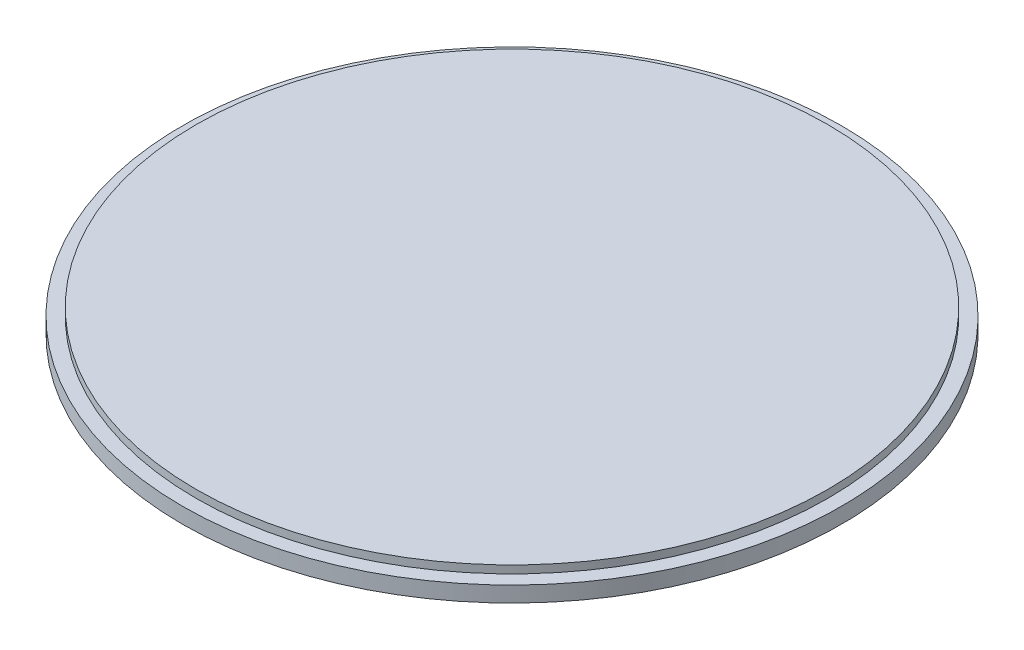
ISO-10303-21;
HEADER;
FILE_DESCRIPTION(('STEP AP214'),'2;1');
FILE_NAME('part.step','',(''),(''),'','','');
FILE_SCHEMA(('AUTOMOTIVE_DESIGN { 1 0 10303 214 1 1 1 1 }'));
ENDSEC;
DATA;
#1=APPLICATION_CONTEXT('core data for automotive mechanical design processes');
#2=APPLICATION_PROTOCOL_DEFINITION('international standard','automotive_design',2000,#1);
#3=PRODUCT_CONTEXT('',#1,'mechanical');
#4=PRODUCT('Part','Part','',(#3));
#5=PRODUCT_RELATED_PRODUCT_CATEGORY('part','',(#4));
#6=PRODUCT_DEFINITION_FORMATION('','',#4);
#7=PRODUCT_DEFINITION_CONTEXT('part definition',#1,'design');
#8=PRODUCT_DEFINITION('design','',#6,#7);
#9=PRODUCT_DEFINITION_SHAPE('','',#8);
#10=(LENGTH_UNIT() NAMED_UNIT(*) SI_UNIT(.MILLI.,.METRE.));
#11=(NAMED_UNIT(*) PLANE_ANGLE_UNIT() SI_UNIT($,.RADIAN.));
#12=(NAMED_UNIT(*) SI_UNIT($,.STERADIAN.) SOLID_ANGLE_UNIT());
#13=UNCERTAINTY_MEASURE_WITH_UNIT(LENGTH_MEASURE(1.E-05),#10,'distance_accuracy_value','');
#14=(GEOMETRIC_REPRESENTATION_CONTEXT(3) GLOBAL_UNCERTAINTY_ASSIGNED_CONTEXT((#13)) GLOBAL_UNIT_ASSIGNED_CONTEXT((#10,
#11,#12)) REPRESENTATION_CONTEXT('',''));
#15=CARTESIAN_POINT('',(0.,0.,0.));
#16=DIRECTION('',(0.,0.,1.));
#17=DIRECTION('',(1.,0.,0.));
#18=AXIS2_PLACEMENT_3D('',#15,#16,#17);
#19=CARTESIAN_POINT('',(0.,0.8,0.));
#20=DIRECTION('',(0.,-1.,0.));
#21=DIRECTION('',(0.,0.,-1.));
#22=AXIS2_PLACEMENT_3D('',#19,#20,#21);
#23=CYLINDRICAL_SURFACE('',#22,16.9);
#24=CARTESIAN_POINT('',(0.,0.8,0.));
#25=DIRECTION('',(0.,1.,0.));
#26=DIRECTION('',(0.,0.,1.));
#27=AXIS2_PLACEMENT_3D('',#24,#25,#26);
#28=CIRCLE('',#27,16.9);
#29=CARTESIAN_POINT('',(0.,0.8,16.9));
#30=VERTEX_POINT('',#29);
#31=EDGE_CURVE('E45',#30,#30,#28,.T.);
#32=ORIENTED_EDGE('',*,*,#31,.F.);
#33=EDGE_LOOP('',(#32));
#34=FACE_BOUND('',#33,.T.);
#35=CARTESIAN_POINT('',(0.,0.,0.));
#36=DIRECTION('',(0.,1.,0.));
#37=DIRECTION('',(0.,0.,1.));
#38=AXIS2_PLACEMENT_3D('',#35,#36,#37);
#39=CIRCLE('',#38,16.9);
#40=CARTESIAN_POINT('',(0.,0.,16.9));
#41=VERTEX_POINT('',#40);
#42=EDGE_CURVE('E40',#41,#41,#39,.T.);
#43=ORIENTED_EDGE('',*,*,#42,.T.);
#44=EDGE_LOOP('',(#43));
#45=FACE_BOUND('',#44,.T.);
#46=ADVANCED_FACE('F37',(#34,#45),#23,.T.);
#47=CARTESIAN_POINT('',(0.,0.8,0.));
#48=DIRECTION('',(0.,1.,0.));
#49=DIRECTION('',(0.,0.,1.));
#50=AXIS2_PLACEMENT_3D('',#47,#48,#49);
#51=PLANE('',#50);
#52=CARTESIAN_POINT('',(0.,0.8,0.));
#53=DIRECTION('',(0.,1.,0.));
#54=DIRECTION('',(0.,0.,1.));
#55=AXIS2_PLACEMENT_3D('',#52,#53,#54);
#56=CIRCLE('',#55,16.2);
#57=CARTESIAN_POINT('',(0.,0.8,16.2));
#58=VERTEX_POINT('',#57);
#59=EDGE_CURVE('E10',#58,#58,#56,.T.);
#60=ORIENTED_EDGE('',*,*,#59,.F.);
#61=EDGE_LOOP('',(#60));
#62=FACE_BOUND('',#61,.T.);
#63=ORIENTED_EDGE('',*,*,#31,.T.);
#64=EDGE_LOOP('',(#63));
#65=FACE_BOUND('',#64,.T.);
#66=ADVANCED_FACE('F65',(#62,#65),#51,.T.);
#67=CARTESIAN_POINT('',(0.,0.,0.));
#68=DIRECTION('',(0.,1.,0.));
#69=DIRECTION('',(0.,0.,1.));
#70=AXIS2_PLACEMENT_3D('',#67,#68,#69);
#71=PLANE('',#70);
#72=ORIENTED_EDGE('',*,*,#42,.F.);
#73=EDGE_LOOP('',(#72));
#74=FACE_BOUND('',#73,.T.);
#75=ADVANCED_FACE('F62',(#74),#71,.F.);
#76=CARTESIAN_POINT('',(0.,1.2,0.));
#77=DIRECTION('',(0.,-1.,0.));
#78=DIRECTION('',(0.,0.,-1.));
#79=AXIS2_PLACEMENT_3D('',#76,#77,#78);
#80=CYLINDRICAL_SURFACE('',#79,16.2);
#81=CARTESIAN_POINT('',(0.,1.2,0.));
#82=DIRECTION('',(0.,1.,0.));
#83=DIRECTION('',(0.,0.,1.));
#84=AXIS2_PLACEMENT_3D('',#81,#82,#83);
#85=CIRCLE('',#84,16.2);
#86=CARTESIAN_POINT('',(0.,1.2,16.2));
#87=VERTEX_POINT('',#86);
#88=EDGE_CURVE('E52',#87,#87,#85,.T.);
#89=ORIENTED_EDGE('',*,*,#88,.F.);
#90=EDGE_LOOP('',(#89));
#91=FACE_BOUND('',#90,.T.);
#92=ORIENTED_EDGE('',*,*,#59,.T.);
#93=EDGE_LOOP('',(#92));
#94=FACE_BOUND('',#93,.T.);
#95=ADVANCED_FACE('F64',(#91,#94),#80,.T.);
#96=CARTESIAN_POINT('',(0.,1.2,0.));
#97=DIRECTION('',(0.,1.,0.));
#98=DIRECTION('',(0.,0.,1.));
#99=AXIS2_PLACEMENT_3D('',#96,#97,#98);
#100=PLANE('',#99);
#101=ORIENTED_EDGE('',*,*,#88,.T.);
#102=EDGE_LOOP('',(#101));
#103=FACE_BOUND('',#102,.T.);
#104=ADVANCED_FACE('F70',(#103),#100,.T.);
#105=CLOSED_SHELL('',(#46,#66,#75,#95,#104));
#106=MANIFOLD_SOLID_BREP('B2',#105);
#107=ADVANCED_BREP_SHAPE_REPRESENTATION('',(#18,#106),#14);
#108=SHAPE_DEFINITION_REPRESENTATION(#9,#107);
ENDSEC;
END-ISO-10303-21;
